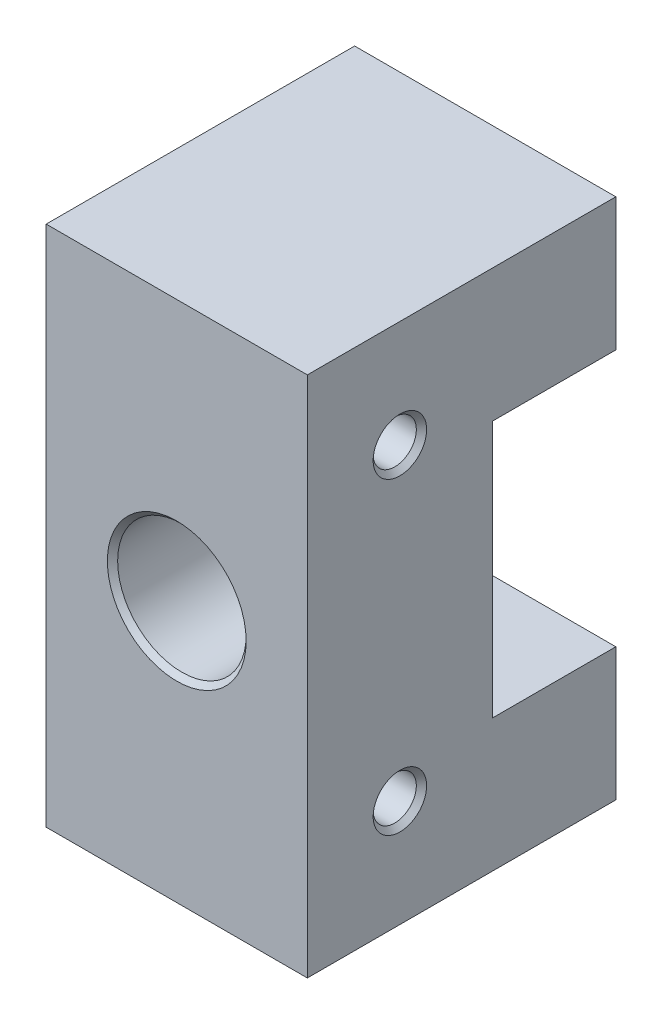
ISO-10303-21;
HEADER;
FILE_DESCRIPTION(('STEP AP214'),'2;1');
FILE_NAME('part.step','',(''),(''),'','','');
FILE_SCHEMA(('AUTOMOTIVE_DESIGN { 1 0 10303 214 1 1 1 1 }'));
ENDSEC;
DATA;
#1=APPLICATION_CONTEXT('core data for automotive mechanical design processes');
#2=APPLICATION_PROTOCOL_DEFINITION('international standard','automotive_design',2000,#1);
#3=PRODUCT_CONTEXT('',#1,'mechanical');
#4=PRODUCT('Part','Part','',(#3));
#5=PRODUCT_RELATED_PRODUCT_CATEGORY('part','',(#4));
#6=PRODUCT_DEFINITION_FORMATION('','',#4);
#7=PRODUCT_DEFINITION_CONTEXT('part definition',#1,'design');
#8=PRODUCT_DEFINITION('design','',#6,#7);
#9=PRODUCT_DEFINITION_SHAPE('','',#8);
#10=(LENGTH_UNIT() NAMED_UNIT(*) SI_UNIT(.MILLI.,.METRE.));
#11=(NAMED_UNIT(*) PLANE_ANGLE_UNIT() SI_UNIT($,.RADIAN.));
#12=(NAMED_UNIT(*) SI_UNIT($,.STERADIAN.) SOLID_ANGLE_UNIT());
#13=UNCERTAINTY_MEASURE_WITH_UNIT(LENGTH_MEASURE(1.E-05),#10,'distance_accuracy_value','');
#14=(GEOMETRIC_REPRESENTATION_CONTEXT(3) GLOBAL_UNCERTAINTY_ASSIGNED_CONTEXT((#13)) GLOBAL_UNIT_ASSIGNED_CONTEXT((#10,
#11,#12)) REPRESENTATION_CONTEXT('',''));
#15=CARTESIAN_POINT('',(0.,0.,0.));
#16=DIRECTION('',(0.,0.,1.));
#17=DIRECTION('',(1.,0.,0.));
#18=AXIS2_PLACEMENT_3D('',#15,#16,#17);
#19=CARTESIAN_POINT('',(12.7,25.4,30.));
#20=DIRECTION('',(-1.,0.,0.));
#21=DIRECTION('',(0.,-1.,0.));
#22=AXIS2_PLACEMENT_3D('',#19,#20,#21);
#23=PLANE('',#22);
#24=CARTESIAN_POINT('',(12.7,-15.,21.));
#25=DIRECTION('',(-1.,0.,0.));
#26=DIRECTION('',(0.,-1.,0.));
#27=AXIS2_PLACEMENT_3D('',#24,#25,#26);
#28=CIRCLE('',#27,2.59999999999997);
#29=CARTESIAN_POINT('',(12.7,-17.6,21.));
#30=VERTEX_POINT('',#29);
#31=EDGE_CURVE('E65',#30,#30,#28,.T.);
#32=ORIENTED_EDGE('',*,*,#31,.T.);
#33=EDGE_LOOP('',(#32));
#34=FACE_BOUND('',#33,.T.);
#35=CARTESIAN_POINT('',(12.7,15.,21.));
#36=DIRECTION('',(-1.,0.,0.));
#37=DIRECTION('',(0.,-1.,0.));
#38=AXIS2_PLACEMENT_3D('',#35,#36,#37);
#39=CIRCLE('',#38,2.60000000000001);
#40=CARTESIAN_POINT('',(12.7,12.4,21.));
#41=VERTEX_POINT('',#40);
#42=EDGE_CURVE('E276',#41,#41,#39,.T.);
#43=ORIENTED_EDGE('',*,*,#42,.T.);
#44=EDGE_LOOP('',(#43));
#45=FACE_BOUND('',#44,.T.);
#46=DIRECTION('',(0.,0.,-1.));
#47=VECTOR('',#46,1.);
#48=CARTESIAN_POINT('',(12.7,-12.5,12.));
#49=LINE('',#48,#47);
#50=CARTESIAN_POINT('',(12.7,-12.5,12.));
#51=VERTEX_POINT('',#50);
#52=CARTESIAN_POINT('',(12.7,-12.5,0.));
#53=VERTEX_POINT('',#52);
#54=EDGE_CURVE('E197',#51,#53,#49,.T.);
#55=ORIENTED_EDGE('',*,*,#54,.F.);
#56=DIRECTION('',(0.,1.,0.));
#57=VECTOR('',#56,1.);
#58=CARTESIAN_POINT('',(12.7,12.5,12.));
#59=LINE('',#58,#57);
#60=CARTESIAN_POINT('',(12.7,12.5,12.));
#61=VERTEX_POINT('',#60);
#62=EDGE_CURVE('E179',#51,#61,#59,.T.);
#63=ORIENTED_EDGE('',*,*,#62,.T.);
#64=DIRECTION('',(0.,0.,-1.));
#65=VECTOR('',#64,1.);
#66=CARTESIAN_POINT('',(12.7,12.5,12.));
#67=LINE('',#66,#65);
#68=CARTESIAN_POINT('',(12.7,12.5,0.));
#69=VERTEX_POINT('',#68);
#70=EDGE_CURVE('E193',#61,#69,#67,.T.);
#71=ORIENTED_EDGE('',*,*,#70,.T.);
#72=DIRECTION('',(0.,1.,0.));
#73=VECTOR('',#72,1.);
#74=CARTESIAN_POINT('',(12.7,25.4,0.));
#75=LINE('',#74,#73);
#76=CARTESIAN_POINT('',(12.7,25.4,0.));
#77=VERTEX_POINT('',#76);
#78=EDGE_CURVE('E204',#69,#77,#75,.T.);
#79=ORIENTED_EDGE('',*,*,#78,.T.);
#80=DIRECTION('',(0.,0.,-1.));
#81=VECTOR('',#80,1.);
#82=CARTESIAN_POINT('',(12.7,25.4,30.));
#83=LINE('',#82,#81);
#84=CARTESIAN_POINT('',(12.7,25.4,30.));
#85=VERTEX_POINT('',#84);
#86=EDGE_CURVE('E239',#85,#77,#83,.T.);
#87=ORIENTED_EDGE('',*,*,#86,.F.);
#88=DIRECTION('',(0.,1.,0.));
#89=VECTOR('',#88,1.);
#90=CARTESIAN_POINT('',(12.7,25.4,30.));
#91=LINE('',#90,#89);
#92=CARTESIAN_POINT('',(12.7,-25.4,30.));
#93=VERTEX_POINT('',#92);
#94=EDGE_CURVE('E205',#93,#85,#91,.T.);
#95=ORIENTED_EDGE('',*,*,#94,.F.);
#96=DIRECTION('',(0.,0.,-1.));
#97=VECTOR('',#96,1.);
#98=CARTESIAN_POINT('',(12.7,-25.4,30.));
#99=LINE('',#98,#97);
#100=CARTESIAN_POINT('',(12.7,-25.4,0.));
#101=VERTEX_POINT('',#100);
#102=EDGE_CURVE('E215',#93,#101,#99,.T.);
#103=ORIENTED_EDGE('',*,*,#102,.T.);
#104=EDGE_CURVE('E216',#101,#53,#75,.T.);
#105=ORIENTED_EDGE('',*,*,#104,.T.);
#106=EDGE_LOOP('',(#55,#63,#71,#79,#87,#95,#103,#105));
#107=FACE_BOUND('',#106,.T.);
#108=ADVANCED_FACE('F55',(#34,#45,#107),#23,.F.);
#109=CARTESIAN_POINT('',(-12.7,25.4,30.));
#110=DIRECTION('',(1.,0.,0.));
#111=DIRECTION('',(0.,1.,0.));
#112=AXIS2_PLACEMENT_3D('',#109,#110,#111);
#113=PLANE('',#112);
#114=CARTESIAN_POINT('',(-12.7,-15.,21.));
#115=DIRECTION('',(1.,0.,0.));
#116=DIRECTION('',(0.,1.,0.));
#117=AXIS2_PLACEMENT_3D('',#114,#115,#116);
#118=CIRCLE('',#117,2.59999999999999);
#119=CARTESIAN_POINT('',(-12.7,-12.4,21.));
#120=VERTEX_POINT('',#119);
#121=EDGE_CURVE('E264',#120,#120,#118,.T.);
#122=ORIENTED_EDGE('',*,*,#121,.T.);
#123=EDGE_LOOP('',(#122));
#124=FACE_BOUND('',#123,.T.);
#125=CARTESIAN_POINT('',(-12.7,15.,21.));
#126=DIRECTION('',(1.,0.,0.));
#127=DIRECTION('',(0.,1.,0.));
#128=AXIS2_PLACEMENT_3D('',#125,#126,#127);
#129=CIRCLE('',#128,2.59999999999998);
#130=CARTESIAN_POINT('',(-12.7,17.6,21.));
#131=VERTEX_POINT('',#130);
#132=EDGE_CURVE('E261',#131,#131,#129,.T.);
#133=ORIENTED_EDGE('',*,*,#132,.T.);
#134=EDGE_LOOP('',(#133));
#135=FACE_BOUND('',#134,.T.);
#136=DIRECTION('',(0.,0.,-1.));
#137=VECTOR('',#136,1.);
#138=CARTESIAN_POINT('',(-12.7,-12.5,12.));
#139=LINE('',#138,#137);
#140=CARTESIAN_POINT('',(-12.7,-12.5,12.));
#141=VERTEX_POINT('',#140);
#142=CARTESIAN_POINT('',(-12.7,-12.5,0.));
#143=VERTEX_POINT('',#142);
#144=EDGE_CURVE('E200',#141,#143,#139,.T.);
#145=ORIENTED_EDGE('',*,*,#144,.T.);
#146=DIRECTION('',(0.,-1.,0.));
#147=VECTOR('',#146,1.);
#148=CARTESIAN_POINT('',(-12.7,25.4,0.));
#149=LINE('',#148,#147);
#150=CARTESIAN_POINT('',(-12.7,-25.4,0.));
#151=VERTEX_POINT('',#150);
#152=EDGE_CURVE('E223',#143,#151,#149,.T.);
#153=ORIENTED_EDGE('',*,*,#152,.T.);
#154=DIRECTION('',(0.,0.,-1.));
#155=VECTOR('',#154,1.);
#156=CARTESIAN_POINT('',(-12.7,-25.4,30.));
#157=LINE('',#156,#155);
#158=CARTESIAN_POINT('',(-12.7,-25.4,30.));
#159=VERTEX_POINT('',#158);
#160=EDGE_CURVE('E232',#159,#151,#157,.T.);
#161=ORIENTED_EDGE('',*,*,#160,.F.);
#162=DIRECTION('',(0.,-1.,0.));
#163=VECTOR('',#162,1.);
#164=CARTESIAN_POINT('',(-12.7,25.4,30.));
#165=LINE('',#164,#163);
#166=CARTESIAN_POINT('',(-12.7,25.4,30.));
#167=VERTEX_POINT('',#166);
#168=EDGE_CURVE('E210',#167,#159,#165,.T.);
#169=ORIENTED_EDGE('',*,*,#168,.F.);
#170=DIRECTION('',(0.,0.,-1.));
#171=VECTOR('',#170,1.);
#172=CARTESIAN_POINT('',(-12.7,25.4,30.));
#173=LINE('',#172,#171);
#174=CARTESIAN_POINT('',(-12.7,25.4,0.));
#175=VERTEX_POINT('',#174);
#176=EDGE_CURVE('E235',#167,#175,#173,.T.);
#177=ORIENTED_EDGE('',*,*,#176,.T.);
#178=CARTESIAN_POINT('',(-12.7,12.5,0.));
#179=VERTEX_POINT('',#178);
#180=EDGE_CURVE('E224',#175,#179,#149,.T.);
#181=ORIENTED_EDGE('',*,*,#180,.T.);
#182=DIRECTION('',(0.,0.,-1.));
#183=VECTOR('',#182,1.);
#184=CARTESIAN_POINT('',(-12.7,12.5,12.));
#185=LINE('',#184,#183);
#186=CARTESIAN_POINT('',(-12.7,12.5,12.));
#187=VERTEX_POINT('',#186);
#188=EDGE_CURVE('E72',#187,#179,#185,.T.);
#189=ORIENTED_EDGE('',*,*,#188,.F.);
#190=DIRECTION('',(0.,-1.,0.));
#191=VECTOR('',#190,1.);
#192=CARTESIAN_POINT('',(-12.7,12.5,12.));
#193=LINE('',#192,#191);
#194=EDGE_CURVE('E171',#187,#141,#193,.T.);
#195=ORIENTED_EDGE('',*,*,#194,.T.);
#196=EDGE_LOOP('',(#145,#153,#161,#169,#177,#181,#189,#195));
#197=FACE_BOUND('',#196,.T.);
#198=ADVANCED_FACE('F311',(#124,#135,#197),#113,.F.);
#199=CARTESIAN_POINT('',(0.,0.,0.));
#200=DIRECTION('',(0.,0.,1.));
#201=DIRECTION('',(1.,0.,0.));
#202=AXIS2_PLACEMENT_3D('',#199,#200,#201);
#203=PLANE('',#202);
#204=DIRECTION('',(1.,0.,0.));
#205=VECTOR('',#204,1.);
#206=CARTESIAN_POINT('',(12.7,-12.5,0.));
#207=LINE('',#206,#205);
#208=EDGE_CURVE('E170',#143,#53,#207,.T.);
#209=ORIENTED_EDGE('',*,*,#208,.T.);
#210=ORIENTED_EDGE('',*,*,#104,.F.);
#211=DIRECTION('',(1.,0.,0.));
#212=VECTOR('',#211,1.);
#213=CARTESIAN_POINT('',(-12.7,-25.4,0.));
#214=LINE('',#213,#212);
#215=EDGE_CURVE('E102',#151,#101,#214,.T.);
#216=ORIENTED_EDGE('',*,*,#215,.F.);
#217=ORIENTED_EDGE('',*,*,#152,.F.);
#218=EDGE_LOOP('',(#209,#210,#216,#217));
#219=FACE_BOUND('',#218,.T.);
#220=ADVANCED_FACE('F317',(#219),#203,.F.);
#221=DIRECTION('',(-1.,0.,0.));
#222=VECTOR('',#221,1.);
#223=CARTESIAN_POINT('',(12.7,12.5,0.));
#224=LINE('',#223,#222);
#225=EDGE_CURVE('E176',#69,#179,#224,.T.);
#226=ORIENTED_EDGE('',*,*,#225,.T.);
#227=ORIENTED_EDGE('',*,*,#180,.F.);
#228=DIRECTION('',(-1.,0.,0.));
#229=VECTOR('',#228,1.);
#230=CARTESIAN_POINT('',(-12.7,25.4,0.));
#231=LINE('',#230,#229);
#232=EDGE_CURVE('E220',#77,#175,#231,.T.);
#233=ORIENTED_EDGE('',*,*,#232,.F.);
#234=ORIENTED_EDGE('',*,*,#78,.F.);
#235=EDGE_LOOP('',(#226,#227,#233,#234));
#236=FACE_BOUND('',#235,.T.);
#237=ADVANCED_FACE('F612',(#236),#203,.F.);
#238=CARTESIAN_POINT('',(-12.7,25.4,30.));
#239=DIRECTION('',(0.,-1.,0.));
#240=DIRECTION('',(0.,0.,-1.));
#241=AXIS2_PLACEMENT_3D('',#238,#239,#240);
#242=PLANE('',#241);
#243=ORIENTED_EDGE('',*,*,#232,.T.);
#244=ORIENTED_EDGE('',*,*,#176,.F.);
#245=DIRECTION('',(-1.,0.,0.));
#246=VECTOR('',#245,1.);
#247=CARTESIAN_POINT('',(-12.7,25.4,30.));
#248=LINE('',#247,#246);
#249=EDGE_CURVE('E110',#85,#167,#248,.T.);
#250=ORIENTED_EDGE('',*,*,#249,.F.);
#251=ORIENTED_EDGE('',*,*,#86,.T.);
#252=EDGE_LOOP('',(#243,#244,#250,#251));
#253=FACE_BOUND('',#252,.T.);
#254=ADVANCED_FACE('F322',(#253),#242,.F.);
#255=CARTESIAN_POINT('',(-12.7,-25.4,30.));
#256=DIRECTION('',(0.,1.,0.));
#257=DIRECTION('',(0.,0.,1.));
#258=AXIS2_PLACEMENT_3D('',#255,#256,#257);
#259=PLANE('',#258);
#260=ORIENTED_EDGE('',*,*,#215,.T.);
#261=ORIENTED_EDGE('',*,*,#102,.F.);
#262=DIRECTION('',(1.,0.,0.));
#263=VECTOR('',#262,1.);
#264=CARTESIAN_POINT('',(-12.7,-25.4,30.));
#265=LINE('',#264,#263);
#266=EDGE_CURVE('E81',#159,#93,#265,.T.);
#267=ORIENTED_EDGE('',*,*,#266,.F.);
#268=ORIENTED_EDGE('',*,*,#160,.T.);
#269=EDGE_LOOP('',(#260,#261,#267,#268));
#270=FACE_BOUND('',#269,.T.);
#271=ADVANCED_FACE('F475',(#270),#259,.F.);
#272=CARTESIAN_POINT('',(0.,0.,30.));
#273=DIRECTION('',(0.,0.,1.));
#274=DIRECTION('',(1.,0.,0.));
#275=AXIS2_PLACEMENT_3D('',#272,#273,#274);
#276=PLANE('',#275);
#277=CARTESIAN_POINT('',(0.,0.,30.));
#278=DIRECTION('',(0.,0.,1.));
#279=DIRECTION('',(1.,0.,0.));
#280=AXIS2_PLACEMENT_3D('',#277,#278,#279);
#281=CIRCLE('',#280,6.75000000000001);
#282=CARTESIAN_POINT('',(6.75000000000001,0.,30.));
#283=VERTEX_POINT('',#282);
#284=EDGE_CURVE('E250',#283,#283,#281,.F.);
#285=ORIENTED_EDGE('',*,*,#284,.T.);
#286=EDGE_LOOP('',(#285));
#287=FACE_BOUND('',#286,.T.);
#288=ORIENTED_EDGE('',*,*,#94,.T.);
#289=ORIENTED_EDGE('',*,*,#249,.T.);
#290=ORIENTED_EDGE('',*,*,#168,.T.);
#291=ORIENTED_EDGE('',*,*,#266,.T.);
#292=EDGE_LOOP('',(#288,#289,#290,#291));
#293=FACE_BOUND('',#292,.T.);
#294=ADVANCED_FACE('F470',(#287,#293),#276,.T.);
#295=CARTESIAN_POINT('',(12.7,-12.5,12.));
#296=DIRECTION('',(0.,1.,0.));
#297=DIRECTION('',(0.,0.,1.));
#298=AXIS2_PLACEMENT_3D('',#295,#296,#297);
#299=PLANE('',#298);
#300=ORIENTED_EDGE('',*,*,#208,.F.);
#301=ORIENTED_EDGE('',*,*,#144,.F.);
#302=DIRECTION('',(1.,0.,0.));
#303=VECTOR('',#302,1.);
#304=CARTESIAN_POINT('',(12.7,-12.5,12.));
#305=LINE('',#304,#303);
#306=EDGE_CURVE('E175',#141,#51,#305,.T.);
#307=ORIENTED_EDGE('',*,*,#306,.T.);
#308=ORIENTED_EDGE('',*,*,#54,.T.);
#309=EDGE_LOOP('',(#300,#301,#307,#308));
#310=FACE_BOUND('',#309,.T.);
#311=ADVANCED_FACE('F474',(#310),#299,.T.);
#312=CARTESIAN_POINT('',(12.7,12.5,12.));
#313=DIRECTION('',(0.,-1.,0.));
#314=DIRECTION('',(0.,0.,-1.));
#315=AXIS2_PLACEMENT_3D('',#312,#313,#314);
#316=PLANE('',#315);
#317=ORIENTED_EDGE('',*,*,#225,.F.);
#318=ORIENTED_EDGE('',*,*,#70,.F.);
#319=DIRECTION('',(-1.,0.,0.));
#320=VECTOR('',#319,1.);
#321=CARTESIAN_POINT('',(12.7,12.5,12.));
#322=LINE('',#321,#320);
#323=EDGE_CURVE('E183',#61,#187,#322,.T.);
#324=ORIENTED_EDGE('',*,*,#323,.T.);
#325=ORIENTED_EDGE('',*,*,#188,.T.);
#326=EDGE_LOOP('',(#317,#318,#324,#325));
#327=FACE_BOUND('',#326,.T.);
#328=ADVANCED_FACE('F485',(#327),#316,.T.);
#329=CARTESIAN_POINT('',(0.,0.,12.));
#330=DIRECTION('',(0.,0.,-1.));
#331=DIRECTION('',(-1.,0.,0.));
#332=AXIS2_PLACEMENT_3D('',#329,#330,#331);
#333=PLANE('',#332);
#334=CARTESIAN_POINT('',(0.,0.,12.));
#335=DIRECTION('',(0.,0.,-1.));
#336=DIRECTION('',(-1.,0.,0.));
#337=AXIS2_PLACEMENT_3D('',#334,#335,#336);
#338=CIRCLE('',#337,6.75);
#339=CARTESIAN_POINT('',(-6.75,0.,12.));
#340=VERTEX_POINT('',#339);
#341=EDGE_CURVE('E254',#340,#340,#338,.F.);
#342=ORIENTED_EDGE('',*,*,#341,.T.);
#343=EDGE_LOOP('',(#342));
#344=FACE_BOUND('',#343,.T.);
#345=ORIENTED_EDGE('',*,*,#194,.F.);
#346=ORIENTED_EDGE('',*,*,#323,.F.);
#347=ORIENTED_EDGE('',*,*,#62,.F.);
#348=ORIENTED_EDGE('',*,*,#306,.F.);
#349=EDGE_LOOP('',(#345,#346,#347,#348));
#350=FACE_BOUND('',#349,.T.);
#351=ADVANCED_FACE('F307',(#344,#350),#333,.T.);
#352=CARTESIAN_POINT('',(0.,0.,12.));
#353=DIRECTION('',(0.,0.,-1.));
#354=DIRECTION('',(-1.,0.,0.));
#355=AXIS2_PLACEMENT_3D('',#352,#353,#354);
#356=CYLINDRICAL_SURFACE('',#355,6.25);
#357=CARTESIAN_POINT('',(0.,0.,29.5));
#358=DIRECTION('',(0.,0.,1.));
#359=DIRECTION('',(1.,0.,0.));
#360=AXIS2_PLACEMENT_3D('',#357,#358,#359);
#361=CIRCLE('',#360,6.25);
#362=CARTESIAN_POINT('',(6.25,0.,29.5));
#363=VERTEX_POINT('',#362);
#364=EDGE_CURVE('E246',#363,#363,#361,.T.);
#365=ORIENTED_EDGE('',*,*,#364,.T.);
#366=EDGE_LOOP('',(#365));
#367=FACE_BOUND('',#366,.T.);
#368=CARTESIAN_POINT('',(0.,0.,12.5));
#369=DIRECTION('',(0.,0.,-1.));
#370=DIRECTION('',(-1.,0.,0.));
#371=AXIS2_PLACEMENT_3D('',#368,#369,#370);
#372=CIRCLE('',#371,6.25);
#373=CARTESIAN_POINT('',(-6.25,0.,12.5));
#374=VERTEX_POINT('',#373);
#375=EDGE_CURVE('E242',#374,#374,#372,.T.);
#376=ORIENTED_EDGE('',*,*,#375,.T.);
#377=EDGE_LOOP('',(#376));
#378=FACE_BOUND('',#377,.T.);
#379=ADVANCED_FACE('F301',(#367,#378),#356,.F.);
#380=CARTESIAN_POINT('',(1.96180729995788,-15.,21.));
#381=DIRECTION('',(1.,0.,0.));
#382=DIRECTION('',(0.,0.,-1.));
#383=AXIS2_PLACEMENT_3D('',#380,#381,#382);
#384=CONICAL_SURFACE('',#383,2.1,1.02974425867665);
#385=CARTESIAN_POINT('',(0.700000000000001,-15.,21.));
#386=VERTEX_POINT('',#385);
#387=VERTEX_LOOP('',#386);
#388=FACE_BOUND('',#387,.T.);
#389=CARTESIAN_POINT('',(1.96180729995788,-15.,21.));
#390=DIRECTION('',(1.,0.,0.));
#391=DIRECTION('',(0.,0.,-1.));
#392=AXIS2_PLACEMENT_3D('',#389,#390,#391);
#393=CIRCLE('',#392,2.1);
#394=CARTESIAN_POINT('',(1.96180729995788,-15.,18.9));
#395=VERTEX_POINT('',#394);
#396=EDGE_CURVE('E166',#395,#395,#393,.T.);
#397=ORIENTED_EDGE('',*,*,#396,.T.);
#398=EDGE_LOOP('',(#397));
#399=FACE_BOUND('',#398,.T.);
#400=ADVANCED_FACE('F296',(#388,#399),#384,.F.);
#401=CARTESIAN_POINT('',(12.7,-15.,21.));
#402=DIRECTION('',(1.,0.,0.));
#403=DIRECTION('',(0.,0.,-1.));
#404=AXIS2_PLACEMENT_3D('',#401,#402,#403);
#405=CYLINDRICAL_SURFACE('',#404,2.09999999999999);
#406=CARTESIAN_POINT('',(12.2,-15.,21.));
#407=DIRECTION('',(-1.,0.,0.));
#408=DIRECTION('',(0.,0.,1.));
#409=AXIS2_PLACEMENT_3D('',#406,#407,#408);
#410=CIRCLE('',#409,2.09999999999999);
#411=CARTESIAN_POINT('',(12.2,-15.,23.1));
#412=VERTEX_POINT('',#411);
#413=EDGE_CURVE('E272',#412,#412,#410,.F.);
#414=ORIENTED_EDGE('',*,*,#413,.T.);
#415=EDGE_LOOP('',(#414));
#416=FACE_BOUND('',#415,.T.);
#417=ORIENTED_EDGE('',*,*,#396,.F.);
#418=EDGE_LOOP('',(#417));
#419=FACE_BOUND('',#418,.T.);
#420=ADVANCED_FACE('F292',(#416,#419),#405,.F.);
#421=CARTESIAN_POINT('',(1.96180729995788,15.,21.));
#422=DIRECTION('',(1.,0.,0.));
#423=DIRECTION('',(0.,0.,-1.));
#424=AXIS2_PLACEMENT_3D('',#421,#422,#423);
#425=CONICAL_SURFACE('',#424,2.1,1.02974425867665);
#426=CARTESIAN_POINT('',(0.699999999999998,15.,21.));
#427=VERTEX_POINT('',#426);
#428=VERTEX_LOOP('',#427);
#429=FACE_BOUND('',#428,.T.);
#430=CARTESIAN_POINT('',(1.96180729995788,15.,21.));
#431=DIRECTION('',(1.,0.,0.));
#432=DIRECTION('',(0.,0.,-1.));
#433=AXIS2_PLACEMENT_3D('',#430,#431,#432);
#434=CIRCLE('',#433,2.1);
#435=CARTESIAN_POINT('',(1.96180729995788,15.,18.9));
#436=VERTEX_POINT('',#435);
#437=EDGE_CURVE('E160',#436,#436,#434,.T.);
#438=ORIENTED_EDGE('',*,*,#437,.T.);
#439=EDGE_LOOP('',(#438));
#440=FACE_BOUND('',#439,.T.);
#441=ADVANCED_FACE('F295',(#429,#440),#425,.F.);
#442=CARTESIAN_POINT('',(12.7,15.,21.));
#443=DIRECTION('',(1.,0.,0.));
#444=DIRECTION('',(0.,0.,-1.));
#445=AXIS2_PLACEMENT_3D('',#442,#443,#444);
#446=CYLINDRICAL_SURFACE('',#445,2.09999999999999);
#447=CARTESIAN_POINT('',(12.2,15.,21.));
#448=DIRECTION('',(-1.,0.,0.));
#449=DIRECTION('',(0.,0.,1.));
#450=AXIS2_PLACEMENT_3D('',#447,#448,#449);
#451=CIRCLE('',#450,2.09999999999999);
#452=CARTESIAN_POINT('',(12.2,15.,23.1));
#453=VERTEX_POINT('',#452);
#454=EDGE_CURVE('E11',#453,#453,#451,.F.);
#455=ORIENTED_EDGE('',*,*,#454,.T.);
#456=EDGE_LOOP('',(#455));
#457=FACE_BOUND('',#456,.T.);
#458=ORIENTED_EDGE('',*,*,#437,.F.);
#459=EDGE_LOOP('',(#458));
#460=FACE_BOUND('',#459,.T.);
#461=ADVANCED_FACE('F371',(#457,#460),#446,.F.);
#462=CARTESIAN_POINT('',(-1.96180729995788,-15.,21.));
#463=DIRECTION('',(-1.,0.,0.));
#464=DIRECTION('',(0.,0.,1.));
#465=AXIS2_PLACEMENT_3D('',#462,#463,#464);
#466=CONICAL_SURFACE('',#465,2.1,1.02974425867665);
#467=CARTESIAN_POINT('',(-0.700000000000001,-15.,21.));
#468=VERTEX_POINT('',#467);
#469=VERTEX_LOOP('',#468);
#470=FACE_BOUND('',#469,.T.);
#471=CARTESIAN_POINT('',(-1.96180729995788,-15.,21.));
#472=DIRECTION('',(-1.,0.,0.));
#473=DIRECTION('',(0.,0.,1.));
#474=AXIS2_PLACEMENT_3D('',#471,#472,#473);
#475=CIRCLE('',#474,2.1);
#476=CARTESIAN_POINT('',(-1.96180729995788,-15.,23.1));
#477=VERTEX_POINT('',#476);
#478=EDGE_CURVE('E153',#477,#477,#475,.T.);
#479=ORIENTED_EDGE('',*,*,#478,.T.);
#480=EDGE_LOOP('',(#479));
#481=FACE_BOUND('',#480,.T.);
#482=ADVANCED_FACE('F367',(#470,#481),#466,.F.);
#483=CARTESIAN_POINT('',(-12.7,-15.,21.));
#484=DIRECTION('',(-1.,0.,0.));
#485=DIRECTION('',(0.,0.,1.));
#486=AXIS2_PLACEMENT_3D('',#483,#484,#485);
#487=CYLINDRICAL_SURFACE('',#486,2.09999999999999);
#488=CARTESIAN_POINT('',(-12.2,-15.,21.));
#489=DIRECTION('',(1.,0.,0.));
#490=DIRECTION('',(0.,0.,-1.));
#491=AXIS2_PLACEMENT_3D('',#488,#489,#490);
#492=CIRCLE('',#491,2.09999999999999);
#493=CARTESIAN_POINT('',(-12.2,-15.,18.9));
#494=VERTEX_POINT('',#493);
#495=EDGE_CURVE('E258',#494,#494,#492,.F.);
#496=ORIENTED_EDGE('',*,*,#495,.T.);
#497=EDGE_LOOP('',(#496));
#498=FACE_BOUND('',#497,.T.);
#499=ORIENTED_EDGE('',*,*,#478,.F.);
#500=EDGE_LOOP('',(#499));
#501=FACE_BOUND('',#500,.T.);
#502=ADVANCED_FACE('F146',(#498,#501),#487,.F.);
#503=CARTESIAN_POINT('',(-1.96180729995788,15.,21.));
#504=DIRECTION('',(-1.,0.,0.));
#505=DIRECTION('',(0.,0.,1.));
#506=AXIS2_PLACEMENT_3D('',#503,#504,#505);
#507=CONICAL_SURFACE('',#506,2.1,1.02974425867665);
#508=CARTESIAN_POINT('',(-0.699999999999998,15.,21.));
#509=VERTEX_POINT('',#508);
#510=VERTEX_LOOP('',#509);
#511=FACE_BOUND('',#510,.T.);
#512=CARTESIAN_POINT('',(-1.96180729995788,15.,21.));
#513=DIRECTION('',(-1.,0.,0.));
#514=DIRECTION('',(0.,0.,1.));
#515=AXIS2_PLACEMENT_3D('',#512,#513,#514);
#516=CIRCLE('',#515,2.1);
#517=CARTESIAN_POINT('',(-1.96180729995788,15.,23.1));
#518=VERTEX_POINT('',#517);
#519=EDGE_CURVE('E150',#518,#518,#516,.T.);
#520=ORIENTED_EDGE('',*,*,#519,.T.);
#521=EDGE_LOOP('',(#520));
#522=FACE_BOUND('',#521,.T.);
#523=ADVANCED_FACE('F142',(#511,#522),#507,.F.);
#524=CARTESIAN_POINT('',(-12.7,15.,21.));
#525=DIRECTION('',(-1.,0.,0.));
#526=DIRECTION('',(0.,0.,1.));
#527=AXIS2_PLACEMENT_3D('',#524,#525,#526);
#528=CYLINDRICAL_SURFACE('',#527,2.09999999999999);
#529=CARTESIAN_POINT('',(-12.2,15.,21.));
#530=DIRECTION('',(1.,0.,0.));
#531=DIRECTION('',(0.,0.,-1.));
#532=AXIS2_PLACEMENT_3D('',#529,#530,#531);
#533=CIRCLE('',#532,2.09999999999999);
#534=CARTESIAN_POINT('',(-12.2,15.,18.9));
#535=VERTEX_POINT('',#534);
#536=EDGE_CURVE('E268',#535,#535,#533,.F.);
#537=ORIENTED_EDGE('',*,*,#536,.T.);
#538=EDGE_LOOP('',(#537));
#539=FACE_BOUND('',#538,.T.);
#540=ORIENTED_EDGE('',*,*,#519,.F.);
#541=EDGE_LOOP('',(#540));
#542=FACE_BOUND('',#541,.T.);
#543=ADVANCED_FACE('F145',(#539,#542),#528,.F.);
#544=CARTESIAN_POINT('',(0.,0.,29.5));
#545=DIRECTION('',(0.,0.,1.));
#546=DIRECTION('',(1.,0.,0.));
#547=AXIS2_PLACEMENT_3D('',#544,#545,#546);
#548=CONICAL_SURFACE('',#547,6.25,0.78539816339746);
#549=ORIENTED_EDGE('',*,*,#284,.F.);
#550=EDGE_LOOP('',(#549));
#551=FACE_BOUND('',#550,.T.);
#552=ORIENTED_EDGE('',*,*,#364,.F.);
#553=EDGE_LOOP('',(#552));
#554=FACE_BOUND('',#553,.T.);
#555=ADVANCED_FACE('F324',(#551,#554),#548,.F.);
#556=CARTESIAN_POINT('',(0.,0.,12.5));
#557=DIRECTION('',(0.,0.,-1.));
#558=DIRECTION('',(-1.,0.,0.));
#559=AXIS2_PLACEMENT_3D('',#556,#557,#558);
#560=CONICAL_SURFACE('',#559,6.25,0.785398163397454);
#561=ORIENTED_EDGE('',*,*,#341,.F.);
#562=EDGE_LOOP('',(#561));
#563=FACE_BOUND('',#562,.T.);
#564=ORIENTED_EDGE('',*,*,#375,.F.);
#565=EDGE_LOOP('',(#564));
#566=FACE_BOUND('',#565,.T.);
#567=ADVANCED_FACE('F330',(#563,#566),#560,.F.);
#568=CARTESIAN_POINT('',(-12.2,-15.,21.));
#569=DIRECTION('',(-1.,0.,0.));
#570=DIRECTION('',(0.,0.,1.));
#571=AXIS2_PLACEMENT_3D('',#568,#569,#570);
#572=CONICAL_SURFACE('',#571,2.09999999999999,0.785398163397451);
#573=ORIENTED_EDGE('',*,*,#121,.F.);
#574=EDGE_LOOP('',(#573));
#575=FACE_BOUND('',#574,.T.);
#576=ORIENTED_EDGE('',*,*,#495,.F.);
#577=EDGE_LOOP('',(#576));
#578=FACE_BOUND('',#577,.T.);
#579=ADVANCED_FACE('F337',(#575,#578),#572,.F.);
#580=CARTESIAN_POINT('',(-12.2,15.,21.));
#581=DIRECTION('',(-1.,0.,0.));
#582=DIRECTION('',(0.,0.,1.));
#583=AXIS2_PLACEMENT_3D('',#580,#581,#582);
#584=CONICAL_SURFACE('',#583,2.09999999999999,0.785398163397448);
#585=ORIENTED_EDGE('',*,*,#132,.F.);
#586=EDGE_LOOP('',(#585));
#587=FACE_BOUND('',#586,.T.);
#588=ORIENTED_EDGE('',*,*,#536,.F.);
#589=EDGE_LOOP('',(#588));
#590=FACE_BOUND('',#589,.T.);
#591=ADVANCED_FACE('F289',(#587,#590),#584,.F.);
#592=CARTESIAN_POINT('',(12.2,-15.,21.));
#593=DIRECTION('',(1.,0.,0.));
#594=DIRECTION('',(0.,0.,-1.));
#595=AXIS2_PLACEMENT_3D('',#592,#593,#594);
#596=CONICAL_SURFACE('',#595,2.09999999999999,0.785398163397447);
#597=ORIENTED_EDGE('',*,*,#31,.F.);
#598=EDGE_LOOP('',(#597));
#599=FACE_BOUND('',#598,.T.);
#600=ORIENTED_EDGE('',*,*,#413,.F.);
#601=EDGE_LOOP('',(#600));
#602=FACE_BOUND('',#601,.T.);
#603=ADVANCED_FACE('F286',(#599,#602),#596,.F.);
#604=CARTESIAN_POINT('',(12.2,15.,21.));
#605=DIRECTION('',(1.,0.,0.));
#606=DIRECTION('',(0.,0.,-1.));
#607=AXIS2_PLACEMENT_3D('',#604,#605,#606);
#608=CONICAL_SURFACE('',#607,2.09999999999999,0.785398163397455);
#609=ORIENTED_EDGE('',*,*,#42,.F.);
#610=EDGE_LOOP('',(#609));
#611=FACE_BOUND('',#610,.T.);
#612=ORIENTED_EDGE('',*,*,#454,.F.);
#613=EDGE_LOOP('',(#612));
#614=FACE_BOUND('',#613,.T.);
#615=ADVANCED_FACE('F58',(#611,#614),#608,.F.);
#616=CLOSED_SHELL('',(#108,#198,#220,#237,#254,#271,#294,#311,#328,#351,#379,#400,#420,#441,
#461,#482,#502,#523,#543,#555,#567,#579,#591,#603,#615));
#617=MANIFOLD_SOLID_BREP('B2',#616);
#618=ADVANCED_BREP_SHAPE_REPRESENTATION('',(#18,#617),#14);
#619=SHAPE_DEFINITION_REPRESENTATION(#9,#618);
ENDSEC;
END-ISO-10303-21;
